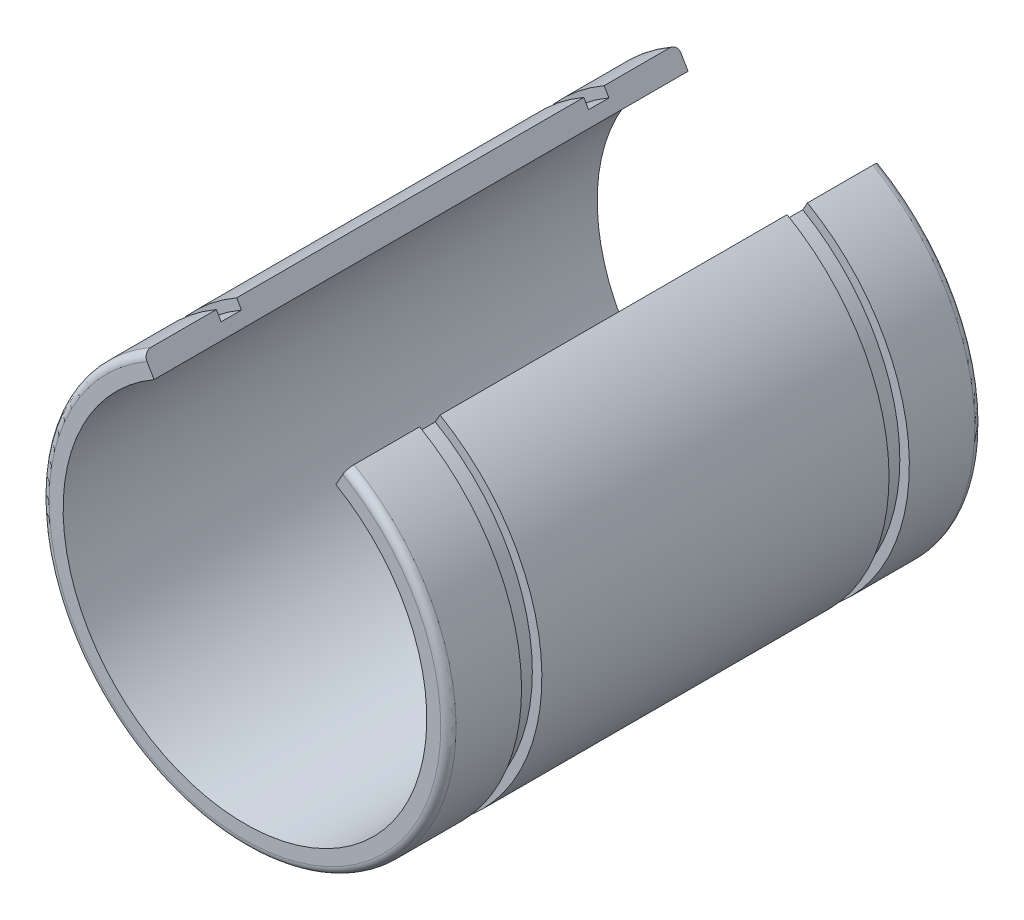
ISO-10303-21;
HEADER;
FILE_DESCRIPTION(('STEP AP214'),'2;1');
FILE_NAME('part.step','',(''),(''),'','','');
FILE_SCHEMA(('AUTOMOTIVE_DESIGN { 1 0 10303 214 1 1 1 1 }'));
ENDSEC;
DATA;
#1=APPLICATION_CONTEXT('core data for automotive mechanical design processes');
#2=APPLICATION_PROTOCOL_DEFINITION('international standard','automotive_design',2000,#1);
#3=PRODUCT_CONTEXT('',#1,'mechanical');
#4=PRODUCT('Part','Part','',(#3));
#5=PRODUCT_RELATED_PRODUCT_CATEGORY('part','',(#4));
#6=PRODUCT_DEFINITION_FORMATION('','',#4);
#7=PRODUCT_DEFINITION_CONTEXT('part definition',#1,'design');
#8=PRODUCT_DEFINITION('design','',#6,#7);
#9=PRODUCT_DEFINITION_SHAPE('','',#8);
#10=(LENGTH_UNIT() NAMED_UNIT(*) SI_UNIT(.MILLI.,.METRE.));
#11=(NAMED_UNIT(*) PLANE_ANGLE_UNIT() SI_UNIT($,.RADIAN.));
#12=(NAMED_UNIT(*) SI_UNIT($,.STERADIAN.) SOLID_ANGLE_UNIT());
#13=UNCERTAINTY_MEASURE_WITH_UNIT(LENGTH_MEASURE(1.E-05),#10,'distance_accuracy_value','');
#14=(GEOMETRIC_REPRESENTATION_CONTEXT(3) GLOBAL_UNCERTAINTY_ASSIGNED_CONTEXT((#13)) GLOBAL_UNIT_ASSIGNED_CONTEXT((#10,
#11,#12)) REPRESENTATION_CONTEXT('',''));
#15=CARTESIAN_POINT('',(0.,0.,0.));
#16=DIRECTION('',(0.,0.,1.));
#17=DIRECTION('',(1.,0.,0.));
#18=AXIS2_PLACEMENT_3D('',#15,#16,#17);
#19=CARTESIAN_POINT('',(0.,0.,42.));
#20=DIRECTION('',(0.,0.,-1.));
#21=DIRECTION('',(-1.,0.,0.));
#22=AXIS2_PLACEMENT_3D('',#19,#20,#21);
#23=CYLINDRICAL_SURFACE('',#22,16.);
#24=CARTESIAN_POINT('',(0.,0.,7.35000000000001));
#25=DIRECTION('',(0.,0.,-1.));
#26=DIRECTION('',(-1.,0.,0.));
#27=AXIS2_PLACEMENT_3D('',#24,#25,#26);
#28=CIRCLE('',#27,16.);
#29=CARTESIAN_POINT('',(7.9865245294577,13.8641777953246,7.35000000000001));
#30=VERTEX_POINT('',#29);
#31=CARTESIAN_POINT('',(-8.00000000000002,13.856406460551,7.35000000000001));
#32=VERTEX_POINT('',#31);
#33=EDGE_CURVE('E145',#30,#32,#28,.T.);
#34=ORIENTED_EDGE('',*,*,#33,.F.);
#35=DIRECTION('',(0.,0.,-1.));
#36=VECTOR('',#35,1.);
#37=CARTESIAN_POINT('',(7.9865245294577,13.8641777953246,42.));
#38=LINE('',#37,#36);
#39=CARTESIAN_POINT('',(7.9865245294577,13.8641777953246,34.65));
#40=VERTEX_POINT('',#39);
#41=EDGE_CURVE('E210',#40,#30,#38,.T.);
#42=ORIENTED_EDGE('',*,*,#41,.F.);
#43=CARTESIAN_POINT('',(0.,0.,34.65));
#44=DIRECTION('',(0.,0.,-1.));
#45=DIRECTION('',(-1.,0.,0.));
#46=AXIS2_PLACEMENT_3D('',#43,#44,#45);
#47=CIRCLE('',#46,16.);
#48=CARTESIAN_POINT('',(-8.00000000000002,13.856406460551,34.65));
#49=VERTEX_POINT('',#48);
#50=EDGE_CURVE('E173',#40,#49,#47,.T.);
#51=ORIENTED_EDGE('',*,*,#50,.T.);
#52=DIRECTION('',(0.,0.,-1.));
#53=VECTOR('',#52,1.);
#54=CARTESIAN_POINT('',(-8.00000000000002,13.856406460551,42.));
#55=LINE('',#54,#53);
#56=EDGE_CURVE('E200',#49,#32,#55,.T.);
#57=ORIENTED_EDGE('',*,*,#56,.T.);
#58=EDGE_LOOP('',(#34,#42,#51,#57));
#59=FACE_BOUND('',#58,.T.);
#60=ADVANCED_FACE('F32',(#59),#23,.T.);
#61=CARTESIAN_POINT('',(-8.00000000000002,13.856406460551,5.75000000000001));
#62=VERTEX_POINT('',#61);
#63=CARTESIAN_POINT('',(-8.00000000000002,13.856406460551,0.600000000000017));
#64=VERTEX_POINT('',#63);
#65=EDGE_CURVE('E191',#62,#64,#55,.T.);
#66=ORIENTED_EDGE('',*,*,#65,.T.);
#67=CARTESIAN_POINT('',(0.,0.,0.600000000000003));
#68=DIRECTION('',(0.,0.,1.));
#69=DIRECTION('',(1.,0.,0.));
#70=AXIS2_PLACEMENT_3D('',#67,#68,#69);
#71=CIRCLE('',#70,16.);
#72=CARTESIAN_POINT('',(7.9865245294577,13.8641777953246,0.600000000000017));
#73=VERTEX_POINT('',#72);
#74=EDGE_CURVE('E221',#64,#73,#71,.T.);
#75=ORIENTED_EDGE('',*,*,#74,.T.);
#76=CARTESIAN_POINT('',(7.9865245294577,13.8641777953246,5.75000000000001));
#77=VERTEX_POINT('',#76);
#78=EDGE_CURVE('E206',#77,#73,#38,.T.);
#79=ORIENTED_EDGE('',*,*,#78,.F.);
#80=CARTESIAN_POINT('',(0.,0.,5.75000000000001));
#81=DIRECTION('',(0.,0.,-1.));
#82=DIRECTION('',(-1.,0.,0.));
#83=AXIS2_PLACEMENT_3D('',#80,#81,#82);
#84=CIRCLE('',#83,16.);
#85=EDGE_CURVE('E139',#77,#62,#84,.T.);
#86=ORIENTED_EDGE('',*,*,#85,.T.);
#87=EDGE_LOOP('',(#66,#75,#79,#86));
#88=FACE_BOUND('',#87,.T.);
#89=ADVANCED_FACE('F240',(#88),#23,.T.);
#90=CARTESIAN_POINT('',(7.9865245294577,13.8641777953246,42.));
#91=DIRECTION('',(0.870564203722301,-0.492054841656248,0.));
#92=DIRECTION('',(0.492054841656248,0.870564203722301,0.));
#93=AXIS2_PLACEMENT_3D('',#90,#91,#92);
#94=PLANE('',#93);
#95=ORIENTED_EDGE('',*,*,#78,.T.);
#96=CARTESIAN_POINT('',(7.9865245294577,13.8641777953246,0.600000000000003));
#97=CARTESIAN_POINT('',(7.98653863840597,13.8642027574716,0.566245850744415));
#98=CARTESIAN_POINT('',(7.98512377900083,13.8616995284672,0.532500272886933));
#99=CARTESIAN_POINT('',(7.97954024015871,13.8518208957731,0.465989554706864));
#100=CARTESIAN_POINT('',(7.97537372323413,13.8444493180918,0.433223665572097));
#101=CARTESIAN_POINT('',(7.96438805019168,13.8250130014561,0.369564410358222));
#102=CARTESIAN_POINT('',(7.95756762151556,13.812946011038,0.338671950820169));
#103=CARTESIAN_POINT('',(7.94147371007741,13.7844719833284,0.279657470437499));
#104=CARTESIAN_POINT('',(7.93220065887439,13.7680657095695,0.251534963390645));
#105=CARTESIAN_POINT('',(7.91146306652561,13.7313758855054,0.198852585517816));
#106=CARTESIAN_POINT('',(7.89999851498159,13.7110923168033,0.174292731596934));
#107=CARTESIAN_POINT('',(7.87520070586658,13.6672189857868,0.129428125457139));
#108=CARTESIAN_POINT('',(7.86186708306898,13.643628577298,0.109124206810546));
#109=CARTESIAN_POINT('',(7.83371008105681,13.5938120203601,0.073350373575996));
#110=CARTESIAN_POINT('',(7.81888636377299,13.5675852737846,0.0578815592517556));
#111=CARTESIAN_POINT('',(7.78817440884037,13.5132483862525,0.0322290659939751));
#112=CARTESIAN_POINT('',(7.77228680037074,13.4851393584664,0.0220422939206542));
#113=CARTESIAN_POINT('',(7.74546524950609,13.4376855380905,0.00977387071490096));
#114=CARTESIAN_POINT('',(7.73469999641677,13.4186391977435,0.00611088370159334));
#115=CARTESIAN_POINT('',(7.71305178835909,13.3803382739149,0.00122427015001458));
#116=CARTESIAN_POINT('',(7.70216902231234,13.3610840246814,-2.8141700180558E-06));
#117=CARTESIAN_POINT('',(7.69128136696908,13.3418211250981,0.));
#118=B_SPLINE_CURVE_WITH_KNOTS('',3,(#96,#97,#98,#99,#100,#101,#102,#103,#104,#105,#106,#107,
#108,#109,#110,#111,#112,#113,#114,#115,#116,#117),.UNSPECIFIED.,.F.,.F.,(4,2,2,2,2,2,2,2,2,2,
4),(0.,0.101127911355762,0.202176441271934,0.303273484074036,0.404352749844552,
0.505432495229108,0.606532019746678,0.707654533487516,0.808717763278798,0.875139514330821,
0.941466911604906),.UNSPECIFIED.);
#119=CARTESIAN_POINT('',(7.69128136696908,13.3418211250981,0.));
#120=VERTEX_POINT('',#119);
#121=EDGE_CURVE('E230',#73,#120,#118,.T.);
#122=ORIENTED_EDGE('',*,*,#121,.T.);
#123=DIRECTION('',(-0.492054841656248,-0.870564203722301,0.));
#124=VECTOR('',#123,1.);
#125=CARTESIAN_POINT('',(7.9865245294577,13.8641777953246,0.));
#126=LINE('',#125,#124);
#127=CARTESIAN_POINT('',(7.15000000000001,12.3841632741175,0.));
#128=VERTEX_POINT('',#127);
#129=EDGE_CURVE('E183',#120,#128,#126,.T.);
#130=ORIENTED_EDGE('',*,*,#129,.T.);
#131=DIRECTION('',(0.,0.,-1.));
#132=VECTOR('',#131,1.);
#133=CARTESIAN_POINT('',(7.15000000000001,12.3841632741175,42.));
#134=LINE('',#133,#132);
#135=CARTESIAN_POINT('',(7.15000000000001,12.3841632741175,42.));
#136=VERTEX_POINT('',#135);
#137=EDGE_CURVE('E203',#136,#128,#134,.T.);
#138=ORIENTED_EDGE('',*,*,#137,.F.);
#139=DIRECTION('',(-0.492054841656248,-0.870564203722301,0.));
#140=VECTOR('',#139,1.);
#141=CARTESIAN_POINT('',(7.9865245294577,13.8641777953246,42.));
#142=LINE('',#141,#140);
#143=CARTESIAN_POINT('',(7.69128136696908,13.3418211250981,42.));
#144=VERTEX_POINT('',#143);
#145=EDGE_CURVE('E184',#144,#136,#142,.T.);
#146=ORIENTED_EDGE('',*,*,#145,.F.);
#147=CARTESIAN_POINT('',(7.69128136696908,13.3418211250981,42.));
#148=CARTESIAN_POINT('',(7.70789167098612,13.3712087763638,42.0000286652376));
#149=CARTESIAN_POINT('',(7.72449776463655,13.4005889784711,41.997153079383));
#150=CARTESIAN_POINT('',(7.7572275278837,13.4584958576786,41.9858049140368));
#151=CARTESIAN_POINT('',(7.77335156501294,13.4870231850329,41.9773367184536));
#152=CARTESIAN_POINT('',(7.80467819445139,13.5424475806564,41.9550088690181));
#153=CARTESIAN_POINT('',(7.81988033998515,13.5693438584715,41.9411466248104));
#154=CARTESIAN_POINT('',(7.84892125432716,13.6207242704281,41.9084362071059));
#155=CARTESIAN_POINT('',(7.86276026318214,13.6452088292703,41.8895889136323));
#156=CARTESIAN_POINT('',(7.88868457845686,13.6910752225533,41.8474405831255));
#157=CARTESIAN_POINT('',(7.90076993165955,13.7124571397643,41.8241396649417));
#158=CARTESIAN_POINT('',(7.9228466058448,13.7515161239585,41.7737396573705));
#159=CARTESIAN_POINT('',(7.93283751684519,13.7691924655838,41.7466398260839));
#160=CARTESIAN_POINT('',(7.95043975250346,13.8003350841952,41.6894140661496));
#161=CARTESIAN_POINT('',(7.95805068982305,13.813800675886,41.6592876459808));
#162=CARTESIAN_POINT('',(7.97067179401906,13.8361304663774,41.5968714845905));
#163=CARTESIAN_POINT('',(7.97568348559689,13.8449973627442,41.5645830241889));
#164=CARTESIAN_POINT('',(7.98171798370914,13.8556738516215,41.5100807200328));
#165=CARTESIAN_POINT('',(7.98351934912591,13.8588609033826,41.4882098084553));
#166=CARTESIAN_POINT('',(7.9859224631563,13.8631125942008,41.4442289882261));
#167=CARTESIAN_POINT('',(7.98652591226229,13.8641802418408,41.4221194632194));
#168=CARTESIAN_POINT('',(7.9865245294577,13.8641777953246,41.4));
#169=B_SPLINE_CURVE_WITH_KNOTS('',3,(#147,#148,#149,#150,#151,#152,#153,#154,#155,#156,#157,
#158,#159,#160,#161,#162,#163,#164,#165,#166,#167,#168),.UNSPECIFIED.,.F.,.F.,(4,2,2,2,2,2,2,2,
2,2,4),(0.,0.101136535908474,0.202193887335775,0.303299829013575,0.404387934105412,
0.505473341934991,0.606578518559267,0.70770014139427,0.808762379631546,0.875161771599773,
0.941466839255825),.UNSPECIFIED.);
#170=CARTESIAN_POINT('',(7.9865245294577,13.8641777953246,41.4));
#171=VERTEX_POINT('',#170);
#172=EDGE_CURVE('E224',#144,#171,#169,.T.);
#173=ORIENTED_EDGE('',*,*,#172,.T.);
#174=CARTESIAN_POINT('',(7.9865245294577,13.8641777953246,36.25));
#175=VERTEX_POINT('',#174);
#176=EDGE_CURVE('E207',#171,#175,#38,.T.);
#177=ORIENTED_EDGE('',*,*,#176,.T.);
#178=DIRECTION('',(0.492054841656248,0.870564203722301,0.));
#179=VECTOR('',#178,1.);
#180=CARTESIAN_POINT('',(7.9865245294577,13.8641777953246,36.25));
#181=LINE('',#180,#179);
#182=CARTESIAN_POINT('',(7.61747045022335,13.2112317343983,36.25));
#183=VERTEX_POINT('',#182);
#184=EDGE_CURVE('E176',#183,#175,#181,.T.);
#185=ORIENTED_EDGE('',*,*,#184,.F.);
#186=DIRECTION('',(0.,0.,-1.));
#187=VECTOR('',#186,1.);
#188=CARTESIAN_POINT('',(7.61747045022335,13.2112317343983,0.));
#189=LINE('',#188,#187);
#190=CARTESIAN_POINT('',(7.61747045022335,13.2112317343983,34.65));
#191=VERTEX_POINT('',#190);
#192=EDGE_CURVE('E179',#191,#183,#189,.F.);
#193=ORIENTED_EDGE('',*,*,#192,.F.);
#194=DIRECTION('',(-0.492054841656248,-0.870564203722301,0.));
#195=VECTOR('',#194,1.);
#196=CARTESIAN_POINT('',(7.9865245294577,13.8641777953246,34.65));
#197=LINE('',#196,#195);
#198=EDGE_CURVE('E181',#40,#191,#197,.T.);
#199=ORIENTED_EDGE('',*,*,#198,.F.);
#200=ORIENTED_EDGE('',*,*,#41,.T.);
#201=DIRECTION('',(0.492054841656248,0.870564203722301,0.));
#202=VECTOR('',#201,1.);
#203=CARTESIAN_POINT('',(7.9865245294577,13.8641777953246,7.35000000000001));
#204=LINE('',#203,#202);
#205=CARTESIAN_POINT('',(7.61747045022335,13.2112317343983,7.35000000000001));
#206=VERTEX_POINT('',#205);
#207=EDGE_CURVE('E159',#206,#30,#204,.T.);
#208=ORIENTED_EDGE('',*,*,#207,.F.);
#209=DIRECTION('',(0.,0.,-1.));
#210=VECTOR('',#209,1.);
#211=CARTESIAN_POINT('',(7.61747045022335,13.2112317343983,0.));
#212=LINE('',#211,#210);
#213=CARTESIAN_POINT('',(7.61747045022335,13.2112317343983,5.75000000000001));
#214=VERTEX_POINT('',#213);
#215=EDGE_CURVE('E144',#214,#206,#212,.F.);
#216=ORIENTED_EDGE('',*,*,#215,.F.);
#217=DIRECTION('',(-0.492054841656248,-0.870564203722301,0.));
#218=VECTOR('',#217,1.);
#219=CARTESIAN_POINT('',(7.9865245294577,13.8641777953246,5.75000000000001));
#220=LINE('',#219,#218);
#221=EDGE_CURVE('E133',#77,#214,#220,.T.);
#222=ORIENTED_EDGE('',*,*,#221,.F.);
#223=EDGE_LOOP('',(#95,#122,#130,#138,#146,#173,#177,#185,#193,#199,#200,#208,#216,#222));
#224=FACE_BOUND('',#223,.T.);
#225=ADVANCED_FACE('F157',(#224),#94,.F.);
#226=CARTESIAN_POINT('',(-8.00000000000002,13.856406460551,42.));
#227=DIRECTION('',(-0.866025403784438,-0.500000000000001,0.));
#228=DIRECTION('',(0.500000000000001,-0.866025403784438,0.));
#229=AXIS2_PLACEMENT_3D('',#226,#227,#228);
#230=PLANE('',#229);
#231=DIRECTION('',(-0.500000000000001,0.866025403784438,0.));
#232=VECTOR('',#231,1.);
#233=CARTESIAN_POINT('',(-8.00000000000002,13.856406460551,0.));
#234=LINE('',#233,#232);
#235=CARTESIAN_POINT('',(-7.15000000000002,12.3841632741175,0.));
#236=VERTEX_POINT('',#235);
#237=CARTESIAN_POINT('',(-7.70000000000002,13.3367912182803,0.));
#238=VERTEX_POINT('',#237);
#239=EDGE_CURVE('E187',#236,#238,#234,.T.);
#240=ORIENTED_EDGE('',*,*,#239,.T.);
#241=CARTESIAN_POINT('',(-7.70000000000002,13.3367912182803,0.600000000000003));
#242=DIRECTION('',(-0.866025403784438,-0.500000000000001,0.));
#243=DIRECTION('',(0.500000000000001,-0.866025403784438,0.));
#244=AXIS2_PLACEMENT_3D('',#241,#242,#243);
#245=CIRCLE('',#244,0.6);
#246=EDGE_CURVE('E260',#238,#64,#245,.F.);
#247=ORIENTED_EDGE('',*,*,#246,.T.);
#248=ORIENTED_EDGE('',*,*,#65,.F.);
#249=DIRECTION('',(-0.500000000000001,0.866025403784438,0.));
#250=VECTOR('',#249,1.);
#251=CARTESIAN_POINT('',(-8.00000000000002,13.856406460551,5.75000000000001));
#252=LINE('',#251,#250);
#253=CARTESIAN_POINT('',(-7.62500000000002,13.2068874077127,5.75000000000001));
#254=VERTEX_POINT('',#253);
#255=EDGE_CURVE('E216',#254,#62,#252,.T.);
#256=ORIENTED_EDGE('',*,*,#255,.F.);
#257=DIRECTION('',(0.,0.,-1.));
#258=VECTOR('',#257,1.);
#259=CARTESIAN_POINT('',(-7.62500000000002,13.2068874077127,0.));
#260=LINE('',#259,#258);
#261=CARTESIAN_POINT('',(-7.62500000000002,13.2068874077127,7.35000000000001));
#262=VERTEX_POINT('',#261);
#263=EDGE_CURVE('E152',#262,#254,#260,.T.);
#264=ORIENTED_EDGE('',*,*,#263,.F.);
#265=DIRECTION('',(0.500000000000001,-0.866025403784438,0.));
#266=VECTOR('',#265,1.);
#267=CARTESIAN_POINT('',(-8.00000000000002,13.856406460551,7.35000000000001));
#268=LINE('',#267,#266);
#269=EDGE_CURVE('E219',#32,#262,#268,.T.);
#270=ORIENTED_EDGE('',*,*,#269,.F.);
#271=ORIENTED_EDGE('',*,*,#56,.F.);
#272=DIRECTION('',(-0.500000000000001,0.866025403784438,0.));
#273=VECTOR('',#272,1.);
#274=CARTESIAN_POINT('',(-8.00000000000002,13.856406460551,34.65));
#275=LINE('',#274,#273);
#276=CARTESIAN_POINT('',(-7.62500000000002,13.2068874077127,34.65));
#277=VERTEX_POINT('',#276);
#278=EDGE_CURVE('E214',#277,#49,#275,.T.);
#279=ORIENTED_EDGE('',*,*,#278,.F.);
#280=DIRECTION('',(0.,0.,-1.));
#281=VECTOR('',#280,1.);
#282=CARTESIAN_POINT('',(-7.62500000000002,13.2068874077127,0.));
#283=LINE('',#282,#281);
#284=CARTESIAN_POINT('',(-7.62500000000002,13.2068874077127,36.25));
#285=VERTEX_POINT('',#284);
#286=EDGE_CURVE('E212',#285,#277,#283,.T.);
#287=ORIENTED_EDGE('',*,*,#286,.F.);
#288=DIRECTION('',(0.500000000000001,-0.866025403784438,0.));
#289=VECTOR('',#288,1.);
#290=CARTESIAN_POINT('',(-8.00000000000002,13.856406460551,36.25));
#291=LINE('',#290,#289);
#292=CARTESIAN_POINT('',(-8.00000000000002,13.856406460551,36.25));
#293=VERTEX_POINT('',#292);
#294=EDGE_CURVE('E209',#293,#285,#291,.T.);
#295=ORIENTED_EDGE('',*,*,#294,.F.);
#296=CARTESIAN_POINT('',(-8.00000000000002,13.856406460551,41.4));
#297=VERTEX_POINT('',#296);
#298=EDGE_CURVE('E197',#297,#293,#55,.T.);
#299=ORIENTED_EDGE('',*,*,#298,.F.);
#300=CARTESIAN_POINT('',(-7.70000000000002,13.3367912182803,41.4));
#301=DIRECTION('',(-0.866025403784438,-0.500000000000001,0.));
#302=DIRECTION('',(0.500000000000001,-0.866025403784438,0.));
#303=AXIS2_PLACEMENT_3D('',#300,#301,#302);
#304=CIRCLE('',#303,0.6);
#305=CARTESIAN_POINT('',(-7.70000000000002,13.3367912182803,42.));
#306=VERTEX_POINT('',#305);
#307=EDGE_CURVE('E48',#297,#306,#304,.F.);
#308=ORIENTED_EDGE('',*,*,#307,.T.);
#309=DIRECTION('',(-0.500000000000001,0.866025403784438,0.));
#310=VECTOR('',#309,1.);
#311=CARTESIAN_POINT('',(-8.00000000000002,13.856406460551,42.));
#312=LINE('',#311,#310);
#313=CARTESIAN_POINT('',(-7.15000000000002,12.3841632741175,42.));
#314=VERTEX_POINT('',#313);
#315=EDGE_CURVE('E189',#314,#306,#312,.T.);
#316=ORIENTED_EDGE('',*,*,#315,.F.);
#317=DIRECTION('',(0.,0.,-1.));
#318=VECTOR('',#317,1.);
#319=CARTESIAN_POINT('',(-7.15000000000002,12.3841632741175,42.));
#320=LINE('',#319,#318);
#321=EDGE_CURVE('E199',#314,#236,#320,.T.);
#322=ORIENTED_EDGE('',*,*,#321,.T.);
#323=EDGE_LOOP('',(#240,#247,#248,#256,#264,#270,#271,#279,#287,#295,#299,#308,#316,#322));
#324=FACE_BOUND('',#323,.T.);
#325=ADVANCED_FACE('F239',(#324),#230,.F.);
#326=ORIENTED_EDGE('',*,*,#176,.F.);
#327=CARTESIAN_POINT('',(0.,0.,41.4));
#328=DIRECTION('',(0.,0.,1.));
#329=DIRECTION('',(1.,0.,0.));
#330=AXIS2_PLACEMENT_3D('',#327,#328,#329);
#331=CIRCLE('',#330,16.);
#332=EDGE_CURVE('E11',#171,#297,#331,.F.);
#333=ORIENTED_EDGE('',*,*,#332,.T.);
#334=ORIENTED_EDGE('',*,*,#298,.T.);
#335=CARTESIAN_POINT('',(0.,0.,36.25));
#336=DIRECTION('',(0.,0.,-1.));
#337=DIRECTION('',(-1.,0.,0.));
#338=AXIS2_PLACEMENT_3D('',#335,#336,#337);
#339=CIRCLE('',#338,16.);
#340=EDGE_CURVE('E161',#175,#293,#339,.T.);
#341=ORIENTED_EDGE('',*,*,#340,.F.);
#342=EDGE_LOOP('',(#326,#333,#334,#341));
#343=FACE_BOUND('',#342,.T.);
#344=ADVANCED_FACE('F246',(#343),#23,.T.);
#345=CARTESIAN_POINT('',(0.,0.,42.));
#346=DIRECTION('',(0.,0.,-1.));
#347=DIRECTION('',(-1.,0.,0.));
#348=AXIS2_PLACEMENT_3D('',#345,#346,#347);
#349=CYLINDRICAL_SURFACE('',#348,14.3);
#350=CARTESIAN_POINT('',(0.,0.,0.));
#351=DIRECTION('',(0.,0.,-1.));
#352=DIRECTION('',(1.,0.,0.));
#353=AXIS2_PLACEMENT_3D('',#350,#351,#352);
#354=CIRCLE('',#353,14.3);
#355=EDGE_CURVE('E193',#128,#236,#354,.T.);
#356=ORIENTED_EDGE('',*,*,#355,.T.);
#357=ORIENTED_EDGE('',*,*,#321,.F.);
#358=CARTESIAN_POINT('',(0.,0.,42.));
#359=DIRECTION('',(0.,0.,-1.));
#360=DIRECTION('',(1.,0.,0.));
#361=AXIS2_PLACEMENT_3D('',#358,#359,#360);
#362=CIRCLE('',#361,14.3);
#363=EDGE_CURVE('E186',#136,#314,#362,.T.);
#364=ORIENTED_EDGE('',*,*,#363,.F.);
#365=ORIENTED_EDGE('',*,*,#137,.T.);
#366=EDGE_LOOP('',(#356,#357,#364,#365));
#367=FACE_BOUND('',#366,.T.);
#368=ADVANCED_FACE('F241',(#367),#349,.F.);
#369=CARTESIAN_POINT('',(0.,0.,42.));
#370=DIRECTION('',(0.,0.,1.));
#371=DIRECTION('',(1.,0.,0.));
#372=AXIS2_PLACEMENT_3D('',#369,#370,#371);
#373=PLANE('',#372);
#374=ORIENTED_EDGE('',*,*,#315,.T.);
#375=CARTESIAN_POINT('',(0.,0.,42.));
#376=DIRECTION('',(0.,0.,1.));
#377=DIRECTION('',(1.,0.,0.));
#378=AXIS2_PLACEMENT_3D('',#375,#376,#377);
#379=CIRCLE('',#378,15.4);
#380=EDGE_CURVE('E41',#306,#144,#379,.T.);
#381=ORIENTED_EDGE('',*,*,#380,.T.);
#382=ORIENTED_EDGE('',*,*,#145,.T.);
#383=ORIENTED_EDGE('',*,*,#363,.T.);
#384=EDGE_LOOP('',(#374,#381,#382,#383));
#385=FACE_BOUND('',#384,.T.);
#386=ADVANCED_FACE('F278',(#385),#373,.T.);
#387=CARTESIAN_POINT('',(0.,0.,0.));
#388=DIRECTION('',(0.,0.,1.));
#389=DIRECTION('',(1.,0.,0.));
#390=AXIS2_PLACEMENT_3D('',#387,#388,#389);
#391=PLANE('',#390);
#392=ORIENTED_EDGE('',*,*,#129,.F.);
#393=CARTESIAN_POINT('',(0.,0.,0.));
#394=DIRECTION('',(0.,0.,1.));
#395=DIRECTION('',(1.,0.,0.));
#396=AXIS2_PLACEMENT_3D('',#393,#394,#395);
#397=CIRCLE('',#396,15.4);
#398=EDGE_CURVE('E261',#120,#238,#397,.F.);
#399=ORIENTED_EDGE('',*,*,#398,.T.);
#400=ORIENTED_EDGE('',*,*,#239,.F.);
#401=ORIENTED_EDGE('',*,*,#355,.F.);
#402=EDGE_LOOP('',(#392,#399,#400,#401));
#403=FACE_BOUND('',#402,.T.);
#404=ADVANCED_FACE('F272',(#403),#391,.F.);
#405=CARTESIAN_POINT('',(16.,0.,34.65));
#406=DIRECTION('',(0.,0.,1.));
#407=DIRECTION('',(1.,0.,0.));
#408=AXIS2_PLACEMENT_3D('',#405,#406,#407);
#409=PLANE('',#408);
#410=ORIENTED_EDGE('',*,*,#198,.T.);
#411=CARTESIAN_POINT('',(0.,0.,34.65));
#412=DIRECTION('',(0.,0.,-1.));
#413=DIRECTION('',(-1.,0.,0.));
#414=AXIS2_PLACEMENT_3D('',#411,#412,#413);
#415=CIRCLE('',#414,15.25);
#416=EDGE_CURVE('E170',#191,#277,#415,.T.);
#417=ORIENTED_EDGE('',*,*,#416,.T.);
#418=ORIENTED_EDGE('',*,*,#278,.T.);
#419=ORIENTED_EDGE('',*,*,#50,.F.);
#420=EDGE_LOOP('',(#410,#417,#418,#419));
#421=FACE_BOUND('',#420,.T.);
#422=ADVANCED_FACE('F294',(#421),#409,.T.);
#423=CARTESIAN_POINT('',(0.,0.,0.));
#424=DIRECTION('',(0.,0.,-1.));
#425=DIRECTION('',(-1.,0.,0.));
#426=AXIS2_PLACEMENT_3D('',#423,#424,#425);
#427=CYLINDRICAL_SURFACE('',#426,15.25);
#428=ORIENTED_EDGE('',*,*,#192,.T.);
#429=CARTESIAN_POINT('',(0.,0.,36.25));
#430=DIRECTION('',(0.,0.,-1.));
#431=DIRECTION('',(-1.,0.,0.));
#432=AXIS2_PLACEMENT_3D('',#429,#430,#431);
#433=CIRCLE('',#432,15.25);
#434=EDGE_CURVE('E167',#183,#285,#433,.T.);
#435=ORIENTED_EDGE('',*,*,#434,.T.);
#436=ORIENTED_EDGE('',*,*,#286,.T.);
#437=ORIENTED_EDGE('',*,*,#416,.F.);
#438=EDGE_LOOP('',(#428,#435,#436,#437));
#439=FACE_BOUND('',#438,.T.);
#440=ADVANCED_FACE('F291',(#439),#427,.T.);
#441=CARTESIAN_POINT('',(16.,0.,36.25));
#442=DIRECTION('',(0.,0.,-1.));
#443=DIRECTION('',(-1.,0.,0.));
#444=AXIS2_PLACEMENT_3D('',#441,#442,#443);
#445=PLANE('',#444);
#446=ORIENTED_EDGE('',*,*,#184,.T.);
#447=ORIENTED_EDGE('',*,*,#340,.T.);
#448=ORIENTED_EDGE('',*,*,#294,.T.);
#449=ORIENTED_EDGE('',*,*,#434,.F.);
#450=EDGE_LOOP('',(#446,#447,#448,#449));
#451=FACE_BOUND('',#450,.T.);
#452=ADVANCED_FACE('F284',(#451),#445,.T.);
#453=CARTESIAN_POINT('',(16.,0.,7.35000000000001));
#454=DIRECTION('',(0.,0.,-1.));
#455=DIRECTION('',(-1.,0.,0.));
#456=AXIS2_PLACEMENT_3D('',#453,#454,#455);
#457=PLANE('',#456);
#458=ORIENTED_EDGE('',*,*,#207,.T.);
#459=ORIENTED_EDGE('',*,*,#33,.T.);
#460=ORIENTED_EDGE('',*,*,#269,.T.);
#461=CARTESIAN_POINT('',(0.,0.,7.35000000000001));
#462=DIRECTION('',(0.,0.,-1.));
#463=DIRECTION('',(-1.,0.,0.));
#464=AXIS2_PLACEMENT_3D('',#461,#462,#463);
#465=CIRCLE('',#464,15.25);
#466=EDGE_CURVE('E154',#206,#262,#465,.T.);
#467=ORIENTED_EDGE('',*,*,#466,.F.);
#468=EDGE_LOOP('',(#458,#459,#460,#467));
#469=FACE_BOUND('',#468,.T.);
#470=ADVANCED_FACE('F304',(#469),#457,.T.);
#471=CARTESIAN_POINT('',(0.,0.,0.));
#472=DIRECTION('',(0.,0.,-1.));
#473=DIRECTION('',(-1.,0.,0.));
#474=AXIS2_PLACEMENT_3D('',#471,#472,#473);
#475=CYLINDRICAL_SURFACE('',#474,15.25);
#476=ORIENTED_EDGE('',*,*,#215,.T.);
#477=ORIENTED_EDGE('',*,*,#466,.T.);
#478=ORIENTED_EDGE('',*,*,#263,.T.);
#479=CARTESIAN_POINT('',(0.,0.,5.75000000000001));
#480=DIRECTION('',(0.,0.,-1.));
#481=DIRECTION('',(-1.,0.,0.));
#482=AXIS2_PLACEMENT_3D('',#479,#480,#481);
#483=CIRCLE('',#482,15.25);
#484=EDGE_CURVE('E136',#214,#254,#483,.T.);
#485=ORIENTED_EDGE('',*,*,#484,.F.);
#486=EDGE_LOOP('',(#476,#477,#478,#485));
#487=FACE_BOUND('',#486,.T.);
#488=ADVANCED_FACE('F148',(#487),#475,.T.);
#489=CARTESIAN_POINT('',(16.,0.,5.75000000000001));
#490=DIRECTION('',(0.,0.,1.));
#491=DIRECTION('',(1.,0.,0.));
#492=AXIS2_PLACEMENT_3D('',#489,#490,#491);
#493=PLANE('',#492);
#494=ORIENTED_EDGE('',*,*,#221,.T.);
#495=ORIENTED_EDGE('',*,*,#484,.T.);
#496=ORIENTED_EDGE('',*,*,#255,.T.);
#497=ORIENTED_EDGE('',*,*,#85,.F.);
#498=EDGE_LOOP('',(#494,#495,#496,#497));
#499=FACE_BOUND('',#498,.T.);
#500=ADVANCED_FACE('F135',(#499),#493,.T.);
#501=CARTESIAN_POINT('',(0.,0.,0.600000000000003));
#502=DIRECTION('',(0.,0.,1.));
#503=DIRECTION('',(1.,0.,0.));
#504=AXIS2_PLACEMENT_3D('',#501,#502,#503);
#505=TOROIDAL_SURFACE('',#504,15.4,0.6);
#506=ORIENTED_EDGE('',*,*,#246,.F.);
#507=ORIENTED_EDGE('',*,*,#398,.F.);
#508=ORIENTED_EDGE('',*,*,#121,.F.);
#509=ORIENTED_EDGE('',*,*,#74,.F.);
#510=EDGE_LOOP('',(#506,#507,#508,#509));
#511=FACE_BOUND('',#510,.T.);
#512=ADVANCED_FACE('F247',(#511),#505,.T.);
#513=CARTESIAN_POINT('',(0.,0.,41.4));
#514=DIRECTION('',(0.,0.,1.));
#515=DIRECTION('',(1.,0.,0.));
#516=AXIS2_PLACEMENT_3D('',#513,#514,#515);
#517=TOROIDAL_SURFACE('',#516,15.4,0.6);
#518=ORIENTED_EDGE('',*,*,#307,.F.);
#519=ORIENTED_EDGE('',*,*,#332,.F.);
#520=ORIENTED_EDGE('',*,*,#172,.F.);
#521=ORIENTED_EDGE('',*,*,#380,.F.);
#522=EDGE_LOOP('',(#518,#519,#520,#521));
#523=FACE_BOUND('',#522,.T.);
#524=ADVANCED_FACE('F34',(#523),#517,.T.);
#525=CLOSED_SHELL('',(#60,#89,#225,#325,#344,#368,#386,#404,#422,#440,#452,#470,#488,#500,#512,#524));
#526=MANIFOLD_SOLID_BREP('B2',#525);
#527=ADVANCED_BREP_SHAPE_REPRESENTATION('',(#18,#526),#14);
#528=SHAPE_DEFINITION_REPRESENTATION(#9,#527);
ENDSEC;
END-ISO-10303-21;
